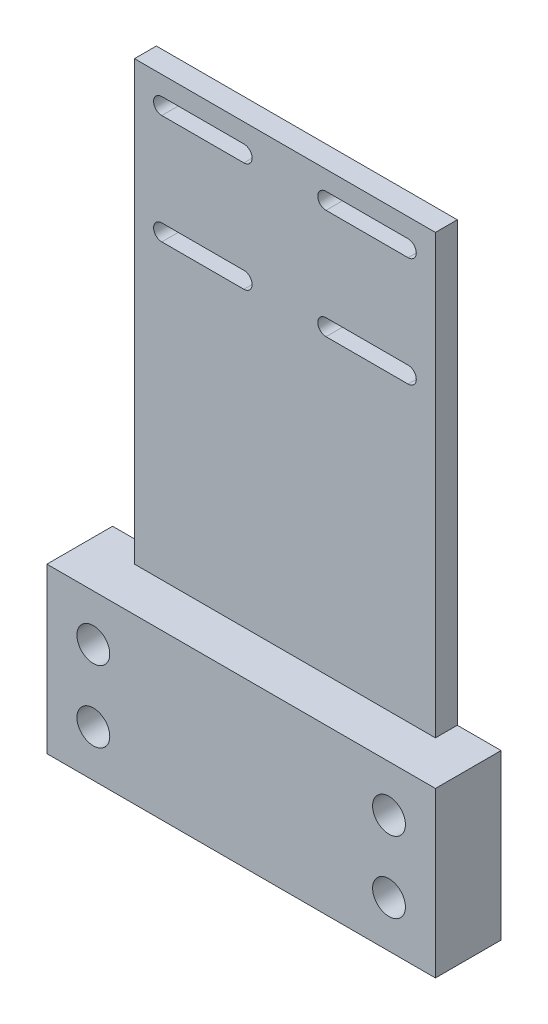
ISO-10303-21;
HEADER;
FILE_DESCRIPTION(('STEP AP214'),'2;1');
FILE_NAME('part.step','',(''),(''),'','','');
FILE_SCHEMA(('AUTOMOTIVE_DESIGN { 1 0 10303 214 1 1 1 1 }'));
ENDSEC;
DATA;
#1=APPLICATION_CONTEXT('core data for automotive mechanical design processes');
#2=APPLICATION_PROTOCOL_DEFINITION('international standard','automotive_design',2000,#1);
#3=PRODUCT_CONTEXT('',#1,'mechanical');
#4=PRODUCT('Part','Part','',(#3));
#5=PRODUCT_RELATED_PRODUCT_CATEGORY('part','',(#4));
#6=PRODUCT_DEFINITION_FORMATION('','',#4);
#7=PRODUCT_DEFINITION_CONTEXT('part definition',#1,'design');
#8=PRODUCT_DEFINITION('design','',#6,#7);
#9=PRODUCT_DEFINITION_SHAPE('','',#8);
#10=(LENGTH_UNIT() NAMED_UNIT(*) SI_UNIT(.MILLI.,.METRE.));
#11=(NAMED_UNIT(*) PLANE_ANGLE_UNIT() SI_UNIT($,.RADIAN.));
#12=(NAMED_UNIT(*) SI_UNIT($,.STERADIAN.) SOLID_ANGLE_UNIT());
#13=UNCERTAINTY_MEASURE_WITH_UNIT(LENGTH_MEASURE(1.E-05),#10,'distance_accuracy_value','');
#14=(GEOMETRIC_REPRESENTATION_CONTEXT(3) GLOBAL_UNCERTAINTY_ASSIGNED_CONTEXT((#13)) GLOBAL_UNIT_ASSIGNED_CONTEXT((#10,
#11,#12)) REPRESENTATION_CONTEXT('',''));
#15=CARTESIAN_POINT('',(0.,0.,0.));
#16=DIRECTION('',(0.,0.,1.));
#17=DIRECTION('',(1.,0.,0.));
#18=AXIS2_PLACEMENT_3D('',#15,#16,#17);
#19=CARTESIAN_POINT('',(27.5,35.,4.));
#20=DIRECTION('',(-1.,0.,0.));
#21=DIRECTION('',(0.,0.,1.));
#22=AXIS2_PLACEMENT_3D('',#19,#20,#21);
#23=PLANE('',#22);
#24=DIRECTION('',(0.,0.,1.));
#25=VECTOR('',#24,1.);
#26=CARTESIAN_POINT('',(27.5,-45.,0.));
#27=LINE('',#26,#25);
#28=CARTESIAN_POINT('',(27.5,-45.,0.));
#29=VERTEX_POINT('',#28);
#30=CARTESIAN_POINT('',(27.5,-45.,4.));
#31=VERTEX_POINT('',#30);
#32=EDGE_CURVE('E65',#29,#31,#27,.T.);
#33=ORIENTED_EDGE('',*,*,#32,.F.);
#34=DIRECTION('',(0.,1.,0.));
#35=VECTOR('',#34,1.);
#36=CARTESIAN_POINT('',(27.5,35.,0.));
#37=LINE('',#36,#35);
#38=CARTESIAN_POINT('',(27.5,35.,0.));
#39=VERTEX_POINT('',#38);
#40=EDGE_CURVE('E453',#29,#39,#37,.T.);
#41=ORIENTED_EDGE('',*,*,#40,.T.);
#42=DIRECTION('',(0.,0.,-1.));
#43=VECTOR('',#42,1.);
#44=CARTESIAN_POINT('',(27.5,35.,4.));
#45=LINE('',#44,#43);
#46=CARTESIAN_POINT('',(27.5,35.,4.));
#47=VERTEX_POINT('',#46);
#48=EDGE_CURVE('E52',#47,#39,#45,.T.);
#49=ORIENTED_EDGE('',*,*,#48,.F.);
#50=DIRECTION('',(0.,1.,0.));
#51=VECTOR('',#50,1.);
#52=CARTESIAN_POINT('',(27.5,35.,4.));
#53=LINE('',#52,#51);
#54=EDGE_CURVE('E454',#31,#47,#53,.T.);
#55=ORIENTED_EDGE('',*,*,#54,.F.);
#56=EDGE_LOOP('',(#33,#41,#49,#55));
#57=FACE_BOUND('',#56,.T.);
#58=ADVANCED_FACE('F49',(#57),#23,.F.);
#59=CARTESIAN_POINT('',(-27.5,35.,4.));
#60=DIRECTION('',(1.,0.,0.));
#61=DIRECTION('',(0.,1.,0.));
#62=AXIS2_PLACEMENT_3D('',#59,#60,#61);
#63=PLANE('',#62);
#64=DIRECTION('',(0.,0.,-1.));
#65=VECTOR('',#64,1.);
#66=CARTESIAN_POINT('',(-27.5,-45.,4.));
#67=LINE('',#66,#65);
#68=CARTESIAN_POINT('',(-27.5,-45.,4.));
#69=VERTEX_POINT('',#68);
#70=CARTESIAN_POINT('',(-27.5,-45.,0.));
#71=VERTEX_POINT('',#70);
#72=EDGE_CURVE('E267',#69,#71,#67,.T.);
#73=ORIENTED_EDGE('',*,*,#72,.F.);
#74=DIRECTION('',(0.,-1.,0.));
#75=VECTOR('',#74,1.);
#76=CARTESIAN_POINT('',(-27.5,35.,4.));
#77=LINE('',#76,#75);
#78=CARTESIAN_POINT('',(-27.5,35.,4.));
#79=VERTEX_POINT('',#78);
#80=EDGE_CURVE('E461',#79,#69,#77,.T.);
#81=ORIENTED_EDGE('',*,*,#80,.F.);
#82=DIRECTION('',(0.,0.,-1.));
#83=VECTOR('',#82,1.);
#84=CARTESIAN_POINT('',(-27.5,35.,4.));
#85=LINE('',#84,#83);
#86=CARTESIAN_POINT('',(-27.5,35.,0.));
#87=VERTEX_POINT('',#86);
#88=EDGE_CURVE('E465',#79,#87,#85,.T.);
#89=ORIENTED_EDGE('',*,*,#88,.T.);
#90=DIRECTION('',(0.,-1.,0.));
#91=VECTOR('',#90,1.);
#92=CARTESIAN_POINT('',(-27.5,35.,0.));
#93=LINE('',#92,#91);
#94=EDGE_CURVE('E458',#87,#71,#93,.T.);
#95=ORIENTED_EDGE('',*,*,#94,.T.);
#96=EDGE_LOOP('',(#73,#81,#89,#95));
#97=FACE_BOUND('',#96,.T.);
#98=ADVANCED_FACE('F494',(#97),#63,.F.);
#99=CARTESIAN_POINT('',(0.,0.,4.));
#100=DIRECTION('',(0.,0.,1.));
#101=DIRECTION('',(1.,0.,0.));
#102=AXIS2_PLACEMENT_3D('',#99,#100,#101);
#103=PLANE('',#102);
#104=DIRECTION('',(-1.,0.,0.));
#105=VECTOR('',#104,1.);
#106=CARTESIAN_POINT('',(-35.5,-45.,4.));
#107=LINE('',#106,#105);
#108=EDGE_CURVE('E11',#31,#69,#107,.T.);
#109=ORIENTED_EDGE('',*,*,#108,.F.);
#110=ORIENTED_EDGE('',*,*,#54,.T.);
#111=DIRECTION('',(-1.,0.,0.));
#112=VECTOR('',#111,1.);
#113=CARTESIAN_POINT('',(-27.5,35.,4.));
#114=LINE('',#113,#112);
#115=EDGE_CURVE('E457',#47,#79,#114,.T.);
#116=ORIENTED_EDGE('',*,*,#115,.T.);
#117=ORIENTED_EDGE('',*,*,#80,.T.);
#118=EDGE_LOOP('',(#109,#110,#116,#117));
#119=FACE_BOUND('',#118,.T.);
#120=DIRECTION('',(1.,0.,0.));
#121=VECTOR('',#120,1.);
#122=CARTESIAN_POINT('',(22.5,28.5,4.));
#123=LINE('',#122,#121);
#124=CARTESIAN_POINT('',(7.50000000000001,28.5,4.));
#125=VERTEX_POINT('',#124);
#126=CARTESIAN_POINT('',(22.5,28.5,4.));
#127=VERTEX_POINT('',#126);
#128=EDGE_CURVE('E414',#125,#127,#123,.T.);
#129=ORIENTED_EDGE('',*,*,#128,.F.);
#130=CARTESIAN_POINT('',(7.50000000000001,30.,4.));
#131=DIRECTION('',(0.,0.,1.));
#132=DIRECTION('',(-1.,0.,0.));
#133=AXIS2_PLACEMENT_3D('',#130,#131,#132);
#134=CIRCLE('',#133,1.5);
#135=CARTESIAN_POINT('',(7.50000000000001,31.5,4.));
#136=VERTEX_POINT('',#135);
#137=EDGE_CURVE('E411',#136,#125,#134,.T.);
#138=ORIENTED_EDGE('',*,*,#137,.F.);
#139=DIRECTION('',(-1.,0.,0.));
#140=VECTOR('',#139,1.);
#141=CARTESIAN_POINT('',(22.4999999999999,31.5,4.));
#142=LINE('',#141,#140);
#143=CARTESIAN_POINT('',(22.4999999999999,31.5,4.));
#144=VERTEX_POINT('',#143);
#145=EDGE_CURVE('E422',#144,#136,#142,.T.);
#146=ORIENTED_EDGE('',*,*,#145,.F.);
#147=CARTESIAN_POINT('',(22.5,30.,4.));
#148=DIRECTION('',(0.,0.,1.));
#149=DIRECTION('',(1.,0.,0.));
#150=AXIS2_PLACEMENT_3D('',#147,#148,#149);
#151=CIRCLE('',#150,1.5);
#152=EDGE_CURVE('E418',#127,#144,#151,.T.);
#153=ORIENTED_EDGE('',*,*,#152,.F.);
#154=EDGE_LOOP('',(#129,#138,#146,#153));
#155=FACE_BOUND('',#154,.T.);
#156=DIRECTION('',(1.,0.,0.));
#157=VECTOR('',#156,1.);
#158=CARTESIAN_POINT('',(22.5,8.5,4.));
#159=LINE('',#158,#157);
#160=CARTESIAN_POINT('',(7.50000000000002,8.5,4.));
#161=VERTEX_POINT('',#160);
#162=CARTESIAN_POINT('',(22.5,8.5,4.));
#163=VERTEX_POINT('',#162);
#164=EDGE_CURVE('E371',#161,#163,#159,.T.);
#165=ORIENTED_EDGE('',*,*,#164,.F.);
#166=CARTESIAN_POINT('',(7.50000000000002,10.,4.));
#167=DIRECTION('',(0.,0.,1.));
#168=DIRECTION('',(-1.,0.,0.));
#169=AXIS2_PLACEMENT_3D('',#166,#167,#168);
#170=CIRCLE('',#169,1.5);
#171=CARTESIAN_POINT('',(7.50000000000002,11.5,4.));
#172=VERTEX_POINT('',#171);
#173=EDGE_CURVE('E368',#172,#161,#170,.T.);
#174=ORIENTED_EDGE('',*,*,#173,.F.);
#175=DIRECTION('',(-1.,0.,0.));
#176=VECTOR('',#175,1.);
#177=CARTESIAN_POINT('',(22.5,11.5,4.));
#178=LINE('',#177,#176);
#179=CARTESIAN_POINT('',(22.5,11.5,4.));
#180=VERTEX_POINT('',#179);
#181=EDGE_CURVE('E379',#180,#172,#178,.T.);
#182=ORIENTED_EDGE('',*,*,#181,.F.);
#183=CARTESIAN_POINT('',(22.5,10.,4.));
#184=DIRECTION('',(0.,0.,1.));
#185=DIRECTION('',(1.,0.,0.));
#186=AXIS2_PLACEMENT_3D('',#183,#184,#185);
#187=CIRCLE('',#186,1.5);
#188=EDGE_CURVE('E375',#163,#180,#187,.T.);
#189=ORIENTED_EDGE('',*,*,#188,.F.);
#190=EDGE_LOOP('',(#165,#174,#182,#189));
#191=FACE_BOUND('',#190,.T.);
#192=DIRECTION('',(-1.,0.,0.));
#193=VECTOR('',#192,1.);
#194=CARTESIAN_POINT('',(-22.5,11.5,4.));
#195=LINE('',#194,#193);
#196=CARTESIAN_POINT('',(-7.5,11.5,4.));
#197=VERTEX_POINT('',#196);
#198=CARTESIAN_POINT('',(-22.5,11.5,4.));
#199=VERTEX_POINT('',#198);
#200=EDGE_CURVE('E328',#197,#199,#195,.T.);
#201=ORIENTED_EDGE('',*,*,#200,.F.);
#202=CARTESIAN_POINT('',(-7.5,10.,4.));
#203=DIRECTION('',(0.,0.,1.));
#204=DIRECTION('',(1.,0.,0.));
#205=AXIS2_PLACEMENT_3D('',#202,#203,#204);
#206=CIRCLE('',#205,1.5);
#207=CARTESIAN_POINT('',(-7.5,8.5,4.));
#208=VERTEX_POINT('',#207);
#209=EDGE_CURVE('E325',#208,#197,#206,.T.);
#210=ORIENTED_EDGE('',*,*,#209,.F.);
#211=DIRECTION('',(1.,0.,0.));
#212=VECTOR('',#211,1.);
#213=CARTESIAN_POINT('',(-22.5,8.5,4.));
#214=LINE('',#213,#212);
#215=CARTESIAN_POINT('',(-22.5,8.5,4.));
#216=VERTEX_POINT('',#215);
#217=EDGE_CURVE('E336',#216,#208,#214,.T.);
#218=ORIENTED_EDGE('',*,*,#217,.F.);
#219=CARTESIAN_POINT('',(-22.5,10.,4.));
#220=DIRECTION('',(0.,0.,1.));
#221=DIRECTION('',(-1.,0.,0.));
#222=AXIS2_PLACEMENT_3D('',#219,#220,#221);
#223=CIRCLE('',#222,1.5);
#224=EDGE_CURVE('E332',#199,#216,#223,.T.);
#225=ORIENTED_EDGE('',*,*,#224,.F.);
#226=EDGE_LOOP('',(#201,#210,#218,#225));
#227=FACE_BOUND('',#226,.T.);
#228=DIRECTION('',(1.,0.,0.));
#229=VECTOR('',#228,1.);
#230=CARTESIAN_POINT('',(-7.5,28.5,4.));
#231=LINE('',#230,#229);
#232=CARTESIAN_POINT('',(-22.5,28.5,4.));
#233=VERTEX_POINT('',#232);
#234=CARTESIAN_POINT('',(-7.5,28.5,4.));
#235=VERTEX_POINT('',#234);
#236=EDGE_CURVE('E285',#233,#235,#231,.T.);
#237=ORIENTED_EDGE('',*,*,#236,.F.);
#238=CARTESIAN_POINT('',(-22.5,30.,4.));
#239=DIRECTION('',(0.,0.,1.));
#240=DIRECTION('',(-1.,0.,0.));
#241=AXIS2_PLACEMENT_3D('',#238,#239,#240);
#242=CIRCLE('',#241,1.5);
#243=CARTESIAN_POINT('',(-22.5,31.5,4.));
#244=VERTEX_POINT('',#243);
#245=EDGE_CURVE('E282',#244,#233,#242,.T.);
#246=ORIENTED_EDGE('',*,*,#245,.F.);
#247=DIRECTION('',(-1.,0.,0.));
#248=VECTOR('',#247,1.);
#249=CARTESIAN_POINT('',(-7.5,31.5,4.));
#250=LINE('',#249,#248);
#251=CARTESIAN_POINT('',(-7.5,31.5,4.));
#252=VERTEX_POINT('',#251);
#253=EDGE_CURVE('E293',#252,#244,#250,.T.);
#254=ORIENTED_EDGE('',*,*,#253,.F.);
#255=CARTESIAN_POINT('',(-7.5,30.,4.));
#256=DIRECTION('',(0.,0.,1.));
#257=DIRECTION('',(1.,0.,0.));
#258=AXIS2_PLACEMENT_3D('',#255,#256,#257);
#259=CIRCLE('',#258,1.5);
#260=EDGE_CURVE('E289',#235,#252,#259,.T.);
#261=ORIENTED_EDGE('',*,*,#260,.F.);
#262=EDGE_LOOP('',(#237,#246,#254,#261));
#263=FACE_BOUND('',#262,.T.);
#264=ADVANCED_FACE('F514',(#119,#155,#191,#227,#263),#103,.T.);
#265=CARTESIAN_POINT('',(0.,0.,0.));
#266=DIRECTION('',(0.,0.,1.));
#267=DIRECTION('',(1.,0.,0.));
#268=AXIS2_PLACEMENT_3D('',#265,#266,#267);
#269=PLANE('',#268);
#270=CARTESIAN_POINT('',(-27.0147186257616,-53.4852813742384,0.));
#271=DIRECTION('',(0.,0.,-1.));
#272=DIRECTION('',(-1.,0.,0.));
#273=AXIS2_PLACEMENT_3D('',#270,#271,#272);
#274=CIRCLE('',#273,5.);
#275=CARTESIAN_POINT('',(-32.0147186257616,-53.4852813742384,0.));
#276=VERTEX_POINT('',#275);
#277=EDGE_CURVE('E539',#276,#276,#274,.T.);
#278=ORIENTED_EDGE('',*,*,#277,.F.);
#279=EDGE_LOOP('',(#278));
#280=FACE_BOUND('',#279,.T.);
#281=CARTESIAN_POINT('',(27.0147186257614,-53.4852813742384,0.));
#282=DIRECTION('',(0.,0.,-1.));
#283=DIRECTION('',(-1.,0.,0.));
#284=AXIS2_PLACEMENT_3D('',#281,#282,#283);
#285=CIRCLE('',#284,5.);
#286=CARTESIAN_POINT('',(22.0147186257614,-53.4852813742384,0.));
#287=VERTEX_POINT('',#286);
#288=EDGE_CURVE('E543',#287,#287,#285,.T.);
#289=ORIENTED_EDGE('',*,*,#288,.F.);
#290=EDGE_LOOP('',(#289));
#291=FACE_BOUND('',#290,.T.);
#292=CARTESIAN_POINT('',(27.0147186257614,-66.5147186257614,0.));
#293=DIRECTION('',(0.,0.,-1.));
#294=DIRECTION('',(-1.,0.,0.));
#295=AXIS2_PLACEMENT_3D('',#292,#293,#294);
#296=CIRCLE('',#295,5.);
#297=CARTESIAN_POINT('',(22.0147186257614,-66.5147186257614,0.));
#298=VERTEX_POINT('',#297);
#299=EDGE_CURVE('E547',#298,#298,#296,.T.);
#300=ORIENTED_EDGE('',*,*,#299,.F.);
#301=EDGE_LOOP('',(#300));
#302=FACE_BOUND('',#301,.T.);
#303=CARTESIAN_POINT('',(-27.0147186257616,-66.5147186257614,0.));
#304=DIRECTION('',(0.,0.,-1.));
#305=DIRECTION('',(-1.,0.,0.));
#306=AXIS2_PLACEMENT_3D('',#303,#304,#305);
#307=CIRCLE('',#306,5.);
#308=CARTESIAN_POINT('',(-32.0147186257616,-66.5147186257614,0.));
#309=VERTEX_POINT('',#308);
#310=EDGE_CURVE('E551',#309,#309,#307,.T.);
#311=ORIENTED_EDGE('',*,*,#310,.F.);
#312=EDGE_LOOP('',(#311));
#313=FACE_BOUND('',#312,.T.);
#314=CARTESIAN_POINT('',(-7.5,10.,0.));
#315=DIRECTION('',(0.,0.,1.));
#316=DIRECTION('',(1.,0.,0.));
#317=AXIS2_PLACEMENT_3D('',#314,#315,#316);
#318=CIRCLE('',#317,1.5);
#319=CARTESIAN_POINT('',(-7.5,8.5,0.));
#320=VERTEX_POINT('',#319);
#321=CARTESIAN_POINT('',(-7.5,11.5,0.));
#322=VERTEX_POINT('',#321);
#323=EDGE_CURVE('E324',#320,#322,#318,.T.);
#324=ORIENTED_EDGE('',*,*,#323,.T.);
#325=DIRECTION('',(-1.,0.,0.));
#326=VECTOR('',#325,1.);
#327=CARTESIAN_POINT('',(-22.5,11.5,0.));
#328=LINE('',#327,#326);
#329=CARTESIAN_POINT('',(-22.5,11.5,0.));
#330=VERTEX_POINT('',#329);
#331=EDGE_CURVE('E343',#322,#330,#328,.T.);
#332=ORIENTED_EDGE('',*,*,#331,.T.);
#333=CARTESIAN_POINT('',(-22.5,10.,0.));
#334=DIRECTION('',(0.,0.,1.));
#335=DIRECTION('',(-1.,0.,0.));
#336=AXIS2_PLACEMENT_3D('',#333,#334,#335);
#337=CIRCLE('',#336,1.5);
#338=CARTESIAN_POINT('',(-22.5,8.5,0.));
#339=VERTEX_POINT('',#338);
#340=EDGE_CURVE('E347',#330,#339,#337,.T.);
#341=ORIENTED_EDGE('',*,*,#340,.T.);
#342=DIRECTION('',(1.,0.,0.));
#343=VECTOR('',#342,1.);
#344=CARTESIAN_POINT('',(-22.5,8.5,0.));
#345=LINE('',#344,#343);
#346=EDGE_CURVE('E329',#339,#320,#345,.T.);
#347=ORIENTED_EDGE('',*,*,#346,.T.);
#348=EDGE_LOOP('',(#324,#332,#341,#347));
#349=FACE_BOUND('',#348,.T.);
#350=CARTESIAN_POINT('',(7.50000000000001,30.,0.));
#351=DIRECTION('',(0.,0.,1.));
#352=DIRECTION('',(-1.,0.,0.));
#353=AXIS2_PLACEMENT_3D('',#350,#351,#352);
#354=CIRCLE('',#353,1.5);
#355=CARTESIAN_POINT('',(7.50000000000001,31.5,0.));
#356=VERTEX_POINT('',#355);
#357=CARTESIAN_POINT('',(7.50000000000001,28.5,0.));
#358=VERTEX_POINT('',#357);
#359=EDGE_CURVE('E410',#356,#358,#354,.T.);
#360=ORIENTED_EDGE('',*,*,#359,.T.);
#361=DIRECTION('',(1.,0.,0.));
#362=VECTOR('',#361,1.);
#363=CARTESIAN_POINT('',(22.5,28.5,0.));
#364=LINE('',#363,#362);
#365=CARTESIAN_POINT('',(22.5,28.5,0.));
#366=VERTEX_POINT('',#365);
#367=EDGE_CURVE('E429',#358,#366,#364,.T.);
#368=ORIENTED_EDGE('',*,*,#367,.T.);
#369=CARTESIAN_POINT('',(22.5,30.,0.));
#370=DIRECTION('',(0.,0.,1.));
#371=DIRECTION('',(1.,0.,0.));
#372=AXIS2_PLACEMENT_3D('',#369,#370,#371);
#373=CIRCLE('',#372,1.5);
#374=CARTESIAN_POINT('',(22.4999999999999,31.5,0.));
#375=VERTEX_POINT('',#374);
#376=EDGE_CURVE('E433',#366,#375,#373,.T.);
#377=ORIENTED_EDGE('',*,*,#376,.T.);
#378=DIRECTION('',(-1.,0.,0.));
#379=VECTOR('',#378,1.);
#380=CARTESIAN_POINT('',(22.4999999999999,31.5,0.));
#381=LINE('',#380,#379);
#382=EDGE_CURVE('E415',#375,#356,#381,.T.);
#383=ORIENTED_EDGE('',*,*,#382,.T.);
#384=EDGE_LOOP('',(#360,#368,#377,#383));
#385=FACE_BOUND('',#384,.T.);
#386=ORIENTED_EDGE('',*,*,#40,.F.);
#387=DIRECTION('',(-1.,0.,0.));
#388=VECTOR('',#387,1.);
#389=CARTESIAN_POINT('',(35.5,-45.,0.));
#390=LINE('',#389,#388);
#391=CARTESIAN_POINT('',(35.5,-45.,0.));
#392=VERTEX_POINT('',#391);
#393=EDGE_CURVE('E261',#392,#29,#390,.T.);
#394=ORIENTED_EDGE('',*,*,#393,.F.);
#395=DIRECTION('',(0.,1.,0.));
#396=VECTOR('',#395,1.);
#397=CARTESIAN_POINT('',(35.5,-75.,0.));
#398=LINE('',#397,#396);
#399=CARTESIAN_POINT('',(35.5,-75.,0.));
#400=VERTEX_POINT('',#399);
#401=EDGE_CURVE('E252',#400,#392,#398,.T.);
#402=ORIENTED_EDGE('',*,*,#401,.F.);
#403=DIRECTION('',(1.,0.,0.));
#404=VECTOR('',#403,1.);
#405=CARTESIAN_POINT('',(27.5,-75.,0.));
#406=LINE('',#405,#404);
#407=CARTESIAN_POINT('',(-35.5,-75.,0.));
#408=VERTEX_POINT('',#407);
#409=EDGE_CURVE('E278',#408,#400,#406,.T.);
#410=ORIENTED_EDGE('',*,*,#409,.F.);
#411=DIRECTION('',(0.,-1.,0.));
#412=VECTOR('',#411,1.);
#413=CARTESIAN_POINT('',(-35.5,-75.,0.));
#414=LINE('',#413,#412);
#415=CARTESIAN_POINT('',(-35.5,-45.,0.));
#416=VERTEX_POINT('',#415);
#417=EDGE_CURVE('E217',#416,#408,#414,.T.);
#418=ORIENTED_EDGE('',*,*,#417,.F.);
#419=DIRECTION('',(1.,0.,0.));
#420=VECTOR('',#419,1.);
#421=CARTESIAN_POINT('',(-35.5,-45.,0.));
#422=LINE('',#421,#420);
#423=EDGE_CURVE('E220',#416,#71,#422,.T.);
#424=ORIENTED_EDGE('',*,*,#423,.T.);
#425=ORIENTED_EDGE('',*,*,#94,.F.);
#426=DIRECTION('',(-1.,0.,0.));
#427=VECTOR('',#426,1.);
#428=CARTESIAN_POINT('',(-27.5,35.,0.));
#429=LINE('',#428,#427);
#430=EDGE_CURVE('E468',#39,#87,#429,.T.);
#431=ORIENTED_EDGE('',*,*,#430,.F.);
#432=EDGE_LOOP('',(#386,#394,#402,#410,#418,#424,#425,#431));
#433=FACE_BOUND('',#432,.T.);
#434=CARTESIAN_POINT('',(7.50000000000002,10.,0.));
#435=DIRECTION('',(0.,0.,1.));
#436=DIRECTION('',(-1.,0.,0.));
#437=AXIS2_PLACEMENT_3D('',#434,#435,#436);
#438=CIRCLE('',#437,1.5);
#439=CARTESIAN_POINT('',(7.50000000000002,11.5,0.));
#440=VERTEX_POINT('',#439);
#441=CARTESIAN_POINT('',(7.50000000000002,8.5,0.));
#442=VERTEX_POINT('',#441);
#443=EDGE_CURVE('E367',#440,#442,#438,.T.);
#444=ORIENTED_EDGE('',*,*,#443,.T.);
#445=DIRECTION('',(1.,0.,0.));
#446=VECTOR('',#445,1.);
#447=CARTESIAN_POINT('',(22.5,8.5,0.));
#448=LINE('',#447,#446);
#449=CARTESIAN_POINT('',(22.5,8.5,0.));
#450=VERTEX_POINT('',#449);
#451=EDGE_CURVE('E386',#442,#450,#448,.T.);
#452=ORIENTED_EDGE('',*,*,#451,.T.);
#453=CARTESIAN_POINT('',(22.5,10.,0.));
#454=DIRECTION('',(0.,0.,1.));
#455=DIRECTION('',(1.,0.,0.));
#456=AXIS2_PLACEMENT_3D('',#453,#454,#455);
#457=CIRCLE('',#456,1.5);
#458=CARTESIAN_POINT('',(22.5,11.5,0.));
#459=VERTEX_POINT('',#458);
#460=EDGE_CURVE('E390',#450,#459,#457,.T.);
#461=ORIENTED_EDGE('',*,*,#460,.T.);
#462=DIRECTION('',(-1.,0.,0.));
#463=VECTOR('',#462,1.);
#464=CARTESIAN_POINT('',(22.5,11.5,0.));
#465=LINE('',#464,#463);
#466=EDGE_CURVE('E372',#459,#440,#465,.T.);
#467=ORIENTED_EDGE('',*,*,#466,.T.);
#468=EDGE_LOOP('',(#444,#452,#461,#467));
#469=FACE_BOUND('',#468,.T.);
#470=CARTESIAN_POINT('',(-22.5,30.,0.));
#471=DIRECTION('',(0.,0.,1.));
#472=DIRECTION('',(-1.,0.,0.));
#473=AXIS2_PLACEMENT_3D('',#470,#471,#472);
#474=CIRCLE('',#473,1.5);
#475=CARTESIAN_POINT('',(-22.5,31.5,0.));
#476=VERTEX_POINT('',#475);
#477=CARTESIAN_POINT('',(-22.5,28.5,0.));
#478=VERTEX_POINT('',#477);
#479=EDGE_CURVE('E281',#476,#478,#474,.T.);
#480=ORIENTED_EDGE('',*,*,#479,.T.);
#481=DIRECTION('',(1.,0.,0.));
#482=VECTOR('',#481,1.);
#483=CARTESIAN_POINT('',(-7.5,28.5,0.));
#484=LINE('',#483,#482);
#485=CARTESIAN_POINT('',(-7.5,28.5,0.));
#486=VERTEX_POINT('',#485);
#487=EDGE_CURVE('E300',#478,#486,#484,.T.);
#488=ORIENTED_EDGE('',*,*,#487,.T.);
#489=CARTESIAN_POINT('',(-7.5,30.,0.));
#490=DIRECTION('',(0.,0.,1.));
#491=DIRECTION('',(1.,0.,0.));
#492=AXIS2_PLACEMENT_3D('',#489,#490,#491);
#493=CIRCLE('',#492,1.5);
#494=CARTESIAN_POINT('',(-7.5,31.5,0.));
#495=VERTEX_POINT('',#494);
#496=EDGE_CURVE('E304',#486,#495,#493,.T.);
#497=ORIENTED_EDGE('',*,*,#496,.T.);
#498=DIRECTION('',(-1.,0.,0.));
#499=VECTOR('',#498,1.);
#500=CARTESIAN_POINT('',(-7.5,31.5,0.));
#501=LINE('',#500,#499);
#502=EDGE_CURVE('E286',#495,#476,#501,.T.);
#503=ORIENTED_EDGE('',*,*,#502,.T.);
#504=EDGE_LOOP('',(#480,#488,#497,#503));
#505=FACE_BOUND('',#504,.T.);
#506=ADVANCED_FACE('F491',(#280,#291,#302,#313,#349,#385,#433,#469,#505),#269,.F.);
#507=CARTESIAN_POINT('',(-27.5,35.,4.));
#508=DIRECTION('',(0.,-1.,0.));
#509=DIRECTION('',(0.,0.,-1.));
#510=AXIS2_PLACEMENT_3D('',#507,#508,#509);
#511=PLANE('',#510);
#512=ORIENTED_EDGE('',*,*,#430,.T.);
#513=ORIENTED_EDGE('',*,*,#88,.F.);
#514=ORIENTED_EDGE('',*,*,#115,.F.);
#515=ORIENTED_EDGE('',*,*,#48,.T.);
#516=EDGE_LOOP('',(#512,#513,#514,#515));
#517=FACE_BOUND('',#516,.T.);
#518=ADVANCED_FACE('F487',(#517),#511,.F.);
#519=CARTESIAN_POINT('',(7.50000000000001,30.,4.));
#520=DIRECTION('',(0.,0.,-1.));
#521=DIRECTION('',(-1.,0.,0.));
#522=AXIS2_PLACEMENT_3D('',#519,#520,#521);
#523=CYLINDRICAL_SURFACE('',#522,1.5);
#524=ORIENTED_EDGE('',*,*,#359,.F.);
#525=DIRECTION('',(0.,0.,-1.));
#526=VECTOR('',#525,1.);
#527=CARTESIAN_POINT('',(7.50000000000001,31.5,4.));
#528=LINE('',#527,#526);
#529=EDGE_CURVE('E425',#136,#356,#528,.T.);
#530=ORIENTED_EDGE('',*,*,#529,.F.);
#531=ORIENTED_EDGE('',*,*,#137,.T.);
#532=DIRECTION('',(0.,0.,-1.));
#533=VECTOR('',#532,1.);
#534=CARTESIAN_POINT('',(7.50000000000001,28.5,4.));
#535=LINE('',#534,#533);
#536=EDGE_CURVE('E449',#125,#358,#535,.T.);
#537=ORIENTED_EDGE('',*,*,#536,.T.);
#538=EDGE_LOOP('',(#524,#530,#531,#537));
#539=FACE_BOUND('',#538,.T.);
#540=ADVANCED_FACE('F523',(#539),#523,.F.);
#541=CARTESIAN_POINT('',(22.5,28.5,4.));
#542=DIRECTION('',(0.,1.,0.));
#543=DIRECTION('',(-1.,0.,0.));
#544=AXIS2_PLACEMENT_3D('',#541,#542,#543);
#545=PLANE('',#544);
#546=ORIENTED_EDGE('',*,*,#367,.F.);
#547=ORIENTED_EDGE('',*,*,#536,.F.);
#548=ORIENTED_EDGE('',*,*,#128,.T.);
#549=DIRECTION('',(0.,0.,-1.));
#550=VECTOR('',#549,1.);
#551=CARTESIAN_POINT('',(22.5,28.5,4.));
#552=LINE('',#551,#550);
#553=EDGE_CURVE('E446',#127,#366,#552,.T.);
#554=ORIENTED_EDGE('',*,*,#553,.T.);
#555=EDGE_LOOP('',(#546,#547,#548,#554));
#556=FACE_BOUND('',#555,.T.);
#557=ADVANCED_FACE('F527',(#556),#545,.T.);
#558=CARTESIAN_POINT('',(22.5,30.,4.));
#559=DIRECTION('',(0.,0.,-1.));
#560=DIRECTION('',(-1.,0.,0.));
#561=AXIS2_PLACEMENT_3D('',#558,#559,#560);
#562=CYLINDRICAL_SURFACE('',#561,1.5);
#563=ORIENTED_EDGE('',*,*,#376,.F.);
#564=ORIENTED_EDGE('',*,*,#553,.F.);
#565=ORIENTED_EDGE('',*,*,#152,.T.);
#566=DIRECTION('',(0.,0.,-1.));
#567=VECTOR('',#566,1.);
#568=CARTESIAN_POINT('',(22.4999999999999,31.5,4.));
#569=LINE('',#568,#567);
#570=EDGE_CURVE('E443',#144,#375,#569,.T.);
#571=ORIENTED_EDGE('',*,*,#570,.T.);
#572=EDGE_LOOP('',(#563,#564,#565,#571));
#573=FACE_BOUND('',#572,.T.);
#574=ADVANCED_FACE('F568',(#573),#562,.F.);
#575=CARTESIAN_POINT('',(22.4999999999999,31.5,4.));
#576=DIRECTION('',(0.,-1.,0.));
#577=DIRECTION('',(1.,0.,0.));
#578=AXIS2_PLACEMENT_3D('',#575,#576,#577);
#579=PLANE('',#578);
#580=ORIENTED_EDGE('',*,*,#382,.F.);
#581=ORIENTED_EDGE('',*,*,#570,.F.);
#582=ORIENTED_EDGE('',*,*,#145,.T.);
#583=ORIENTED_EDGE('',*,*,#529,.T.);
#584=EDGE_LOOP('',(#580,#581,#582,#583));
#585=FACE_BOUND('',#584,.T.);
#586=ADVANCED_FACE('F558',(#585),#579,.T.);
#587=CARTESIAN_POINT('',(7.50000000000002,10.,4.));
#588=DIRECTION('',(0.,0.,-1.));
#589=DIRECTION('',(-1.,0.,0.));
#590=AXIS2_PLACEMENT_3D('',#587,#588,#589);
#591=CYLINDRICAL_SURFACE('',#590,1.5);
#592=ORIENTED_EDGE('',*,*,#443,.F.);
#593=DIRECTION('',(0.,0.,-1.));
#594=VECTOR('',#593,1.);
#595=CARTESIAN_POINT('',(7.50000000000002,11.5,4.));
#596=LINE('',#595,#594);
#597=EDGE_CURVE('E382',#172,#440,#596,.T.);
#598=ORIENTED_EDGE('',*,*,#597,.F.);
#599=ORIENTED_EDGE('',*,*,#173,.T.);
#600=DIRECTION('',(0.,0.,-1.));
#601=VECTOR('',#600,1.);
#602=CARTESIAN_POINT('',(7.50000000000002,8.5,4.));
#603=LINE('',#602,#601);
#604=EDGE_CURVE('E406',#161,#442,#603,.T.);
#605=ORIENTED_EDGE('',*,*,#604,.T.);
#606=EDGE_LOOP('',(#592,#598,#599,#605));
#607=FACE_BOUND('',#606,.T.);
#608=ADVANCED_FACE('F575',(#607),#591,.F.);
#609=CARTESIAN_POINT('',(22.5,8.5,4.));
#610=DIRECTION('',(0.,1.,0.));
#611=DIRECTION('',(-1.,0.,0.));
#612=AXIS2_PLACEMENT_3D('',#609,#610,#611);
#613=PLANE('',#612);
#614=ORIENTED_EDGE('',*,*,#451,.F.);
#615=ORIENTED_EDGE('',*,*,#604,.F.);
#616=ORIENTED_EDGE('',*,*,#164,.T.);
#617=DIRECTION('',(0.,0.,-1.));
#618=VECTOR('',#617,1.);
#619=CARTESIAN_POINT('',(22.5,8.5,4.));
#620=LINE('',#619,#618);
#621=EDGE_CURVE('E403',#163,#450,#620,.T.);
#622=ORIENTED_EDGE('',*,*,#621,.T.);
#623=EDGE_LOOP('',(#614,#615,#616,#622));
#624=FACE_BOUND('',#623,.T.);
#625=ADVANCED_FACE('F581',(#624),#613,.T.);
#626=CARTESIAN_POINT('',(22.5,10.,4.));
#627=DIRECTION('',(0.,0.,-1.));
#628=DIRECTION('',(-1.,0.,0.));
#629=AXIS2_PLACEMENT_3D('',#626,#627,#628);
#630=CYLINDRICAL_SURFACE('',#629,1.5);
#631=ORIENTED_EDGE('',*,*,#460,.F.);
#632=ORIENTED_EDGE('',*,*,#621,.F.);
#633=ORIENTED_EDGE('',*,*,#188,.T.);
#634=DIRECTION('',(0.,0.,-1.));
#635=VECTOR('',#634,1.);
#636=CARTESIAN_POINT('',(22.5,11.5,4.));
#637=LINE('',#636,#635);
#638=EDGE_CURVE('E400',#180,#459,#637,.T.);
#639=ORIENTED_EDGE('',*,*,#638,.T.);
#640=EDGE_LOOP('',(#631,#632,#633,#639));
#641=FACE_BOUND('',#640,.T.);
#642=ADVANCED_FACE('F585',(#641),#630,.F.);
#643=CARTESIAN_POINT('',(22.5,11.5,4.));
#644=DIRECTION('',(0.,-1.,0.));
#645=DIRECTION('',(1.,0.,0.));
#646=AXIS2_PLACEMENT_3D('',#643,#644,#645);
#647=PLANE('',#646);
#648=ORIENTED_EDGE('',*,*,#466,.F.);
#649=ORIENTED_EDGE('',*,*,#638,.F.);
#650=ORIENTED_EDGE('',*,*,#181,.T.);
#651=ORIENTED_EDGE('',*,*,#597,.T.);
#652=EDGE_LOOP('',(#648,#649,#650,#651));
#653=FACE_BOUND('',#652,.T.);
#654=ADVANCED_FACE('F589',(#653),#647,.T.);
#655=CARTESIAN_POINT('',(-7.5,10.,4.));
#656=DIRECTION('',(0.,0.,-1.));
#657=DIRECTION('',(-1.,0.,0.));
#658=AXIS2_PLACEMENT_3D('',#655,#656,#657);
#659=CYLINDRICAL_SURFACE('',#658,1.5);
#660=ORIENTED_EDGE('',*,*,#323,.F.);
#661=DIRECTION('',(0.,0.,-1.));
#662=VECTOR('',#661,1.);
#663=CARTESIAN_POINT('',(-7.5,8.5,4.));
#664=LINE('',#663,#662);
#665=EDGE_CURVE('E339',#208,#320,#664,.T.);
#666=ORIENTED_EDGE('',*,*,#665,.F.);
#667=ORIENTED_EDGE('',*,*,#209,.T.);
#668=DIRECTION('',(0.,0.,-1.));
#669=VECTOR('',#668,1.);
#670=CARTESIAN_POINT('',(-7.5,11.5,4.));
#671=LINE('',#670,#669);
#672=EDGE_CURVE('E363',#197,#322,#671,.T.);
#673=ORIENTED_EDGE('',*,*,#672,.T.);
#674=EDGE_LOOP('',(#660,#666,#667,#673));
#675=FACE_BOUND('',#674,.T.);
#676=ADVANCED_FACE('F593',(#675),#659,.F.);
#677=CARTESIAN_POINT('',(-22.5,11.5,4.));
#678=DIRECTION('',(0.,-1.,0.));
#679=DIRECTION('',(0.,0.,-1.));
#680=AXIS2_PLACEMENT_3D('',#677,#678,#679);
#681=PLANE('',#680);
#682=ORIENTED_EDGE('',*,*,#331,.F.);
#683=ORIENTED_EDGE('',*,*,#672,.F.);
#684=ORIENTED_EDGE('',*,*,#200,.T.);
#685=DIRECTION('',(0.,0.,-1.));
#686=VECTOR('',#685,1.);
#687=CARTESIAN_POINT('',(-22.5,11.5,4.));
#688=LINE('',#687,#686);
#689=EDGE_CURVE('E360',#199,#330,#688,.T.);
#690=ORIENTED_EDGE('',*,*,#689,.T.);
#691=EDGE_LOOP('',(#682,#683,#684,#690));
#692=FACE_BOUND('',#691,.T.);
#693=ADVANCED_FACE('F597',(#692),#681,.T.);
#694=CARTESIAN_POINT('',(-22.5,10.,4.));
#695=DIRECTION('',(0.,0.,-1.));
#696=DIRECTION('',(-1.,0.,0.));
#697=AXIS2_PLACEMENT_3D('',#694,#695,#696);
#698=CYLINDRICAL_SURFACE('',#697,1.5);
#699=ORIENTED_EDGE('',*,*,#340,.F.);
#700=ORIENTED_EDGE('',*,*,#689,.F.);
#701=ORIENTED_EDGE('',*,*,#224,.T.);
#702=DIRECTION('',(0.,0.,-1.));
#703=VECTOR('',#702,1.);
#704=CARTESIAN_POINT('',(-22.5,8.5,4.));
#705=LINE('',#704,#703);
#706=EDGE_CURVE('E357',#216,#339,#705,.T.);
#707=ORIENTED_EDGE('',*,*,#706,.T.);
#708=EDGE_LOOP('',(#699,#700,#701,#707));
#709=FACE_BOUND('',#708,.T.);
#710=ADVANCED_FACE('F601',(#709),#698,.F.);
#711=CARTESIAN_POINT('',(-22.5,8.5,4.));
#712=DIRECTION('',(0.,1.,0.));
#713=DIRECTION('',(0.,0.,1.));
#714=AXIS2_PLACEMENT_3D('',#711,#712,#713);
#715=PLANE('',#714);
#716=ORIENTED_EDGE('',*,*,#346,.F.);
#717=ORIENTED_EDGE('',*,*,#706,.F.);
#718=ORIENTED_EDGE('',*,*,#217,.T.);
#719=ORIENTED_EDGE('',*,*,#665,.T.);
#720=EDGE_LOOP('',(#716,#717,#718,#719));
#721=FACE_BOUND('',#720,.T.);
#722=ADVANCED_FACE('F605',(#721),#715,.T.);
#723=CARTESIAN_POINT('',(-22.5,30.,4.));
#724=DIRECTION('',(0.,0.,-1.));
#725=DIRECTION('',(-1.,0.,0.));
#726=AXIS2_PLACEMENT_3D('',#723,#724,#725);
#727=CYLINDRICAL_SURFACE('',#726,1.5);
#728=ORIENTED_EDGE('',*,*,#479,.F.);
#729=DIRECTION('',(0.,0.,-1.));
#730=VECTOR('',#729,1.);
#731=CARTESIAN_POINT('',(-22.5,31.5,4.));
#732=LINE('',#731,#730);
#733=EDGE_CURVE('E296',#244,#476,#732,.T.);
#734=ORIENTED_EDGE('',*,*,#733,.F.);
#735=ORIENTED_EDGE('',*,*,#245,.T.);
#736=DIRECTION('',(0.,0.,-1.));
#737=VECTOR('',#736,1.);
#738=CARTESIAN_POINT('',(-22.5,28.5,4.));
#739=LINE('',#738,#737);
#740=EDGE_CURVE('E320',#233,#478,#739,.T.);
#741=ORIENTED_EDGE('',*,*,#740,.T.);
#742=EDGE_LOOP('',(#728,#734,#735,#741));
#743=FACE_BOUND('',#742,.T.);
#744=ADVANCED_FACE('F609',(#743),#727,.F.);
#745=CARTESIAN_POINT('',(-7.5,28.5,4.));
#746=DIRECTION('',(0.,1.,0.));
#747=DIRECTION('',(0.,0.,1.));
#748=AXIS2_PLACEMENT_3D('',#745,#746,#747);
#749=PLANE('',#748);
#750=ORIENTED_EDGE('',*,*,#487,.F.);
#751=ORIENTED_EDGE('',*,*,#740,.F.);
#752=ORIENTED_EDGE('',*,*,#236,.T.);
#753=DIRECTION('',(0.,0.,-1.));
#754=VECTOR('',#753,1.);
#755=CARTESIAN_POINT('',(-7.5,28.5,4.));
#756=LINE('',#755,#754);
#757=EDGE_CURVE('E317',#235,#486,#756,.T.);
#758=ORIENTED_EDGE('',*,*,#757,.T.);
#759=EDGE_LOOP('',(#750,#751,#752,#758));
#760=FACE_BOUND('',#759,.T.);
#761=ADVANCED_FACE('F613',(#760),#749,.T.);
#762=CARTESIAN_POINT('',(-7.5,30.,4.));
#763=DIRECTION('',(0.,0.,-1.));
#764=DIRECTION('',(-1.,0.,0.));
#765=AXIS2_PLACEMENT_3D('',#762,#763,#764);
#766=CYLINDRICAL_SURFACE('',#765,1.5);
#767=ORIENTED_EDGE('',*,*,#496,.F.);
#768=ORIENTED_EDGE('',*,*,#757,.F.);
#769=ORIENTED_EDGE('',*,*,#260,.T.);
#770=DIRECTION('',(0.,0.,-1.));
#771=VECTOR('',#770,1.);
#772=CARTESIAN_POINT('',(-7.5,31.5,4.));
#773=LINE('',#772,#771);
#774=EDGE_CURVE('E314',#252,#495,#773,.T.);
#775=ORIENTED_EDGE('',*,*,#774,.T.);
#776=EDGE_LOOP('',(#767,#768,#769,#775));
#777=FACE_BOUND('',#776,.T.);
#778=ADVANCED_FACE('F617',(#777),#766,.F.);
#779=CARTESIAN_POINT('',(-7.5,31.5,4.));
#780=DIRECTION('',(0.,-1.,0.));
#781=DIRECTION('',(0.,0.,-1.));
#782=AXIS2_PLACEMENT_3D('',#779,#780,#781);
#783=PLANE('',#782);
#784=ORIENTED_EDGE('',*,*,#502,.F.);
#785=ORIENTED_EDGE('',*,*,#774,.F.);
#786=ORIENTED_EDGE('',*,*,#253,.T.);
#787=ORIENTED_EDGE('',*,*,#733,.T.);
#788=EDGE_LOOP('',(#784,#785,#786,#787));
#789=FACE_BOUND('',#788,.T.);
#790=ADVANCED_FACE('F621',(#789),#783,.T.);
#791=CARTESIAN_POINT('',(0.,-75.,0.));
#792=DIRECTION('',(0.,1.,0.));
#793=DIRECTION('',(0.,0.,1.));
#794=AXIS2_PLACEMENT_3D('',#791,#792,#793);
#795=PLANE('',#794);
#796=ORIENTED_EDGE('',*,*,#409,.T.);
#797=DIRECTION('',(0.,0.,-1.));
#798=VECTOR('',#797,1.);
#799=CARTESIAN_POINT('',(35.5,-75.,0.));
#800=LINE('',#799,#798);
#801=CARTESIAN_POINT('',(35.5,-75.,12.));
#802=VERTEX_POINT('',#801);
#803=EDGE_CURVE('E226',#802,#400,#800,.T.);
#804=ORIENTED_EDGE('',*,*,#803,.F.);
#805=DIRECTION('',(1.,0.,0.));
#806=VECTOR('',#805,1.);
#807=CARTESIAN_POINT('',(-35.5,-75.,12.));
#808=LINE('',#807,#806);
#809=CARTESIAN_POINT('',(-35.5,-75.,12.));
#810=VERTEX_POINT('',#809);
#811=EDGE_CURVE('E223',#810,#802,#808,.T.);
#812=ORIENTED_EDGE('',*,*,#811,.F.);
#813=DIRECTION('',(0.,0.,1.));
#814=VECTOR('',#813,1.);
#815=CARTESIAN_POINT('',(-35.5,-75.,4.));
#816=LINE('',#815,#814);
#817=EDGE_CURVE('E211',#408,#810,#816,.T.);
#818=ORIENTED_EDGE('',*,*,#817,.F.);
#819=EDGE_LOOP('',(#796,#804,#812,#818));
#820=FACE_BOUND('',#819,.T.);
#821=ADVANCED_FACE('F224',(#820),#795,.F.);
#822=CARTESIAN_POINT('',(-35.5,-45.,4.));
#823=DIRECTION('',(0.,-1.,0.));
#824=DIRECTION('',(1.,0.,0.));
#825=AXIS2_PLACEMENT_3D('',#822,#823,#824);
#826=PLANE('',#825);
#827=ORIENTED_EDGE('',*,*,#72,.T.);
#828=ORIENTED_EDGE('',*,*,#423,.F.);
#829=DIRECTION('',(0.,0.,-1.));
#830=VECTOR('',#829,1.);
#831=CARTESIAN_POINT('',(-35.5,-45.,4.));
#832=LINE('',#831,#830);
#833=CARTESIAN_POINT('',(-35.5,-45.,12.));
#834=VERTEX_POINT('',#833);
#835=EDGE_CURVE('E268',#834,#416,#832,.T.);
#836=ORIENTED_EDGE('',*,*,#835,.F.);
#837=DIRECTION('',(-1.,0.,0.));
#838=VECTOR('',#837,1.);
#839=CARTESIAN_POINT('',(-35.5,-45.,12.));
#840=LINE('',#839,#838);
#841=CARTESIAN_POINT('',(35.5,-45.,12.));
#842=VERTEX_POINT('',#841);
#843=EDGE_CURVE('E236',#842,#834,#840,.T.);
#844=ORIENTED_EDGE('',*,*,#843,.F.);
#845=DIRECTION('',(0.,0.,1.));
#846=VECTOR('',#845,1.);
#847=CARTESIAN_POINT('',(35.5,-45.,0.));
#848=LINE('',#847,#846);
#849=EDGE_CURVE('E256',#392,#842,#848,.T.);
#850=ORIENTED_EDGE('',*,*,#849,.F.);
#851=ORIENTED_EDGE('',*,*,#393,.T.);
#852=ORIENTED_EDGE('',*,*,#32,.T.);
#853=ORIENTED_EDGE('',*,*,#108,.T.);
#854=EDGE_LOOP('',(#827,#828,#836,#844,#850,#851,#852,#853));
#855=FACE_BOUND('',#854,.T.);
#856=ADVANCED_FACE('F495',(#855),#826,.F.);
#857=CARTESIAN_POINT('',(-35.5,0.,0.));
#858=DIRECTION('',(-1.,0.,0.));
#859=DIRECTION('',(0.,0.,1.));
#860=AXIS2_PLACEMENT_3D('',#857,#858,#859);
#861=PLANE('',#860);
#862=ORIENTED_EDGE('',*,*,#817,.T.);
#863=DIRECTION('',(0.,-1.,0.));
#864=VECTOR('',#863,1.);
#865=CARTESIAN_POINT('',(-35.5,-75.,12.));
#866=LINE('',#865,#864);
#867=EDGE_CURVE('E215',#834,#810,#866,.T.);
#868=ORIENTED_EDGE('',*,*,#867,.F.);
#869=ORIENTED_EDGE('',*,*,#835,.T.);
#870=ORIENTED_EDGE('',*,*,#417,.T.);
#871=EDGE_LOOP('',(#862,#868,#869,#870));
#872=FACE_BOUND('',#871,.T.);
#873=ADVANCED_FACE('F213',(#872),#861,.T.);
#874=CARTESIAN_POINT('',(35.5,0.,0.));
#875=DIRECTION('',(1.,0.,0.));
#876=DIRECTION('',(0.,0.,-1.));
#877=AXIS2_PLACEMENT_3D('',#874,#875,#876);
#878=PLANE('',#877);
#879=ORIENTED_EDGE('',*,*,#401,.T.);
#880=ORIENTED_EDGE('',*,*,#849,.T.);
#881=DIRECTION('',(0.,1.,0.));
#882=VECTOR('',#881,1.);
#883=CARTESIAN_POINT('',(35.5,-75.,12.));
#884=LINE('',#883,#882);
#885=EDGE_CURVE('E231',#802,#842,#884,.T.);
#886=ORIENTED_EDGE('',*,*,#885,.F.);
#887=ORIENTED_EDGE('',*,*,#803,.T.);
#888=EDGE_LOOP('',(#879,#880,#886,#887));
#889=FACE_BOUND('',#888,.T.);
#890=ADVANCED_FACE('F498',(#889),#878,.T.);
#891=CARTESIAN_POINT('',(0.,0.,12.));
#892=DIRECTION('',(0.,0.,-1.));
#893=DIRECTION('',(-1.,0.,0.));
#894=AXIS2_PLACEMENT_3D('',#891,#892,#893);
#895=PLANE('',#894);
#896=CARTESIAN_POINT('',(-27.0147186257616,-66.5147186257616,12.));
#897=DIRECTION('',(0.,0.,1.));
#898=DIRECTION('',(1.,0.,0.));
#899=AXIS2_PLACEMENT_3D('',#896,#897,#898);
#900=CIRCLE('',#899,3.);
#901=CARTESIAN_POINT('',(-24.0147186257616,-66.5147186257616,12.));
#902=VERTEX_POINT('',#901);
#903=EDGE_CURVE('E811',#902,#902,#900,.T.);
#904=ORIENTED_EDGE('',*,*,#903,.F.);
#905=EDGE_LOOP('',(#904));
#906=FACE_BOUND('',#905,.T.);
#907=CARTESIAN_POINT('',(-27.0147186257614,-53.4852813742386,12.));
#908=DIRECTION('',(0.,0.,1.));
#909=DIRECTION('',(1.,0.,0.));
#910=AXIS2_PLACEMENT_3D('',#907,#908,#909);
#911=CIRCLE('',#910,3.);
#912=CARTESIAN_POINT('',(-24.0147186257614,-53.4852813742386,12.));
#913=VERTEX_POINT('',#912);
#914=EDGE_CURVE('E801',#913,#913,#911,.T.);
#915=ORIENTED_EDGE('',*,*,#914,.F.);
#916=EDGE_LOOP('',(#915));
#917=FACE_BOUND('',#916,.T.);
#918=CARTESIAN_POINT('',(27.0147186257614,-53.4852813742386,12.));
#919=DIRECTION('',(0.,0.,1.));
#920=DIRECTION('',(1.,0.,0.));
#921=AXIS2_PLACEMENT_3D('',#918,#919,#920);
#922=CIRCLE('',#921,3.);
#923=CARTESIAN_POINT('',(30.0147186257614,-53.4852813742386,12.));
#924=VERTEX_POINT('',#923);
#925=EDGE_CURVE('E244',#924,#924,#922,.T.);
#926=ORIENTED_EDGE('',*,*,#925,.F.);
#927=EDGE_LOOP('',(#926));
#928=FACE_BOUND('',#927,.T.);
#929=CARTESIAN_POINT('',(27.0147186257614,-66.5147186257616,12.));
#930=DIRECTION('',(0.,0.,1.));
#931=DIRECTION('',(1.,0.,0.));
#932=AXIS2_PLACEMENT_3D('',#929,#930,#931);
#933=CIRCLE('',#932,3.);
#934=CARTESIAN_POINT('',(30.0147186257614,-66.5147186257616,12.));
#935=VERTEX_POINT('',#934);
#936=EDGE_CURVE('E238',#935,#935,#933,.T.);
#937=ORIENTED_EDGE('',*,*,#936,.F.);
#938=EDGE_LOOP('',(#937));
#939=FACE_BOUND('',#938,.T.);
#940=ORIENTED_EDGE('',*,*,#867,.T.);
#941=ORIENTED_EDGE('',*,*,#811,.T.);
#942=ORIENTED_EDGE('',*,*,#885,.T.);
#943=ORIENTED_EDGE('',*,*,#843,.T.);
#944=EDGE_LOOP('',(#940,#941,#942,#943));
#945=FACE_BOUND('',#944,.T.);
#946=ADVANCED_FACE('F234',(#906,#917,#928,#939,#945),#895,.F.);
#947=CARTESIAN_POINT('',(27.0147186257614,-66.5147186257616,4.));
#948=DIRECTION('',(0.,0.,1.));
#949=DIRECTION('',(1.,0.,0.));
#950=AXIS2_PLACEMENT_3D('',#947,#948,#949);
#951=CYLINDRICAL_SURFACE('',#950,3.);
#952=CARTESIAN_POINT('',(27.0147186257614,-66.5147186257616,4.));
#953=DIRECTION('',(0.,0.,1.));
#954=DIRECTION('',(1.,0.,0.));
#955=AXIS2_PLACEMENT_3D('',#952,#953,#954);
#956=CIRCLE('',#955,3.);
#957=CARTESIAN_POINT('',(30.0147186257614,-66.5147186257616,4.));
#958=VERTEX_POINT('',#957);
#959=EDGE_CURVE('E806',#958,#958,#956,.T.);
#960=ORIENTED_EDGE('',*,*,#959,.F.);
#961=EDGE_LOOP('',(#960));
#962=FACE_BOUND('',#961,.T.);
#963=ORIENTED_EDGE('',*,*,#936,.T.);
#964=EDGE_LOOP('',(#963));
#965=FACE_BOUND('',#964,.T.);
#966=ADVANCED_FACE('F505',(#962,#965),#951,.F.);
#967=CARTESIAN_POINT('',(27.0147186257614,-53.4852813742386,4.));
#968=DIRECTION('',(0.,0.,1.));
#969=DIRECTION('',(1.,0.,0.));
#970=AXIS2_PLACEMENT_3D('',#967,#968,#969);
#971=CYLINDRICAL_SURFACE('',#970,3.);
#972=CARTESIAN_POINT('',(27.0147186257614,-53.4852813742386,4.));
#973=DIRECTION('',(0.,0.,1.));
#974=DIRECTION('',(1.,0.,0.));
#975=AXIS2_PLACEMENT_3D('',#972,#973,#974);
#976=CIRCLE('',#975,3.);
#977=CARTESIAN_POINT('',(30.0147186257614,-53.4852813742386,4.));
#978=VERTEX_POINT('',#977);
#979=EDGE_CURVE('E802',#978,#978,#976,.T.);
#980=ORIENTED_EDGE('',*,*,#979,.F.);
#981=EDGE_LOOP('',(#980));
#982=FACE_BOUND('',#981,.T.);
#983=ORIENTED_EDGE('',*,*,#925,.T.);
#984=EDGE_LOOP('',(#983));
#985=FACE_BOUND('',#984,.T.);
#986=ADVANCED_FACE('F664',(#982,#985),#971,.F.);
#987=CARTESIAN_POINT('',(-27.0147186257614,-53.4852813742386,4.));
#988=DIRECTION('',(0.,0.,1.));
#989=DIRECTION('',(1.,0.,0.));
#990=AXIS2_PLACEMENT_3D('',#987,#988,#989);
#991=CYLINDRICAL_SURFACE('',#990,3.);
#992=CARTESIAN_POINT('',(-27.0147186257614,-53.4852813742386,4.));
#993=DIRECTION('',(0.,0.,1.));
#994=DIRECTION('',(1.,0.,0.));
#995=AXIS2_PLACEMENT_3D('',#992,#993,#994);
#996=CIRCLE('',#995,3.);
#997=CARTESIAN_POINT('',(-24.0147186257614,-53.4852813742386,4.));
#998=VERTEX_POINT('',#997);
#999=EDGE_CURVE('E807',#998,#998,#996,.T.);
#1000=ORIENTED_EDGE('',*,*,#999,.F.);
#1001=EDGE_LOOP('',(#1000));
#1002=FACE_BOUND('',#1001,.T.);
#1003=ORIENTED_EDGE('',*,*,#914,.T.);
#1004=EDGE_LOOP('',(#1003));
#1005=FACE_BOUND('',#1004,.T.);
#1006=ADVANCED_FACE('F674',(#1002,#1005),#991,.F.);
#1007=CARTESIAN_POINT('',(-27.0147186257616,-66.5147186257616,4.));
#1008=DIRECTION('',(0.,0.,1.));
#1009=DIRECTION('',(1.,0.,0.));
#1010=AXIS2_PLACEMENT_3D('',#1007,#1008,#1009);
#1011=CYLINDRICAL_SURFACE('',#1010,3.);
#1012=CARTESIAN_POINT('',(-27.0147186257616,-66.5147186257616,4.));
#1013=DIRECTION('',(0.,0.,1.));
#1014=DIRECTION('',(1.,0.,0.));
#1015=AXIS2_PLACEMENT_3D('',#1012,#1013,#1014);
#1016=CIRCLE('',#1015,3.);
#1017=CARTESIAN_POINT('',(-24.0147186257616,-66.5147186257616,4.));
#1018=VERTEX_POINT('',#1017);
#1019=EDGE_CURVE('E795',#1018,#1018,#1016,.T.);
#1020=ORIENTED_EDGE('',*,*,#1019,.F.);
#1021=EDGE_LOOP('',(#1020));
#1022=FACE_BOUND('',#1021,.T.);
#1023=ORIENTED_EDGE('',*,*,#903,.T.);
#1024=EDGE_LOOP('',(#1023));
#1025=FACE_BOUND('',#1024,.T.);
#1026=ADVANCED_FACE('F684',(#1022,#1025),#1011,.F.);
#1027=CARTESIAN_POINT('',(0.,0.,3.99999999999999));
#1028=DIRECTION('',(0.,0.,-1.));
#1029=DIRECTION('',(-1.,0.,0.));
#1030=AXIS2_PLACEMENT_3D('',#1027,#1028,#1029);
#1031=PLANE('',#1030);
#1032=CARTESIAN_POINT('',(-27.0147186257616,-66.5147186257614,3.99999999999999));
#1033=DIRECTION('',(0.,0.,-1.));
#1034=DIRECTION('',(-1.,0.,0.));
#1035=AXIS2_PLACEMENT_3D('',#1032,#1033,#1034);
#1036=CIRCLE('',#1035,5.);
#1037=CARTESIAN_POINT('',(-32.0147186257616,-66.5147186257614,3.99999999999999));
#1038=VERTEX_POINT('',#1037);
#1039=EDGE_CURVE('E791',#1038,#1038,#1036,.T.);
#1040=ORIENTED_EDGE('',*,*,#1039,.T.);
#1041=EDGE_LOOP('',(#1040));
#1042=FACE_BOUND('',#1041,.T.);
#1043=ORIENTED_EDGE('',*,*,#1019,.T.);
#1044=EDGE_LOOP('',(#1043));
#1045=FACE_BOUND('',#1044,.T.);
#1046=ADVANCED_FACE('F693',(#1042,#1045),#1031,.T.);
#1047=CARTESIAN_POINT('',(-27.0147186257616,-66.5147186257614,3.99999999999999));
#1048=DIRECTION('',(0.,0.,-1.));
#1049=DIRECTION('',(-1.,0.,0.));
#1050=AXIS2_PLACEMENT_3D('',#1047,#1048,#1049);
#1051=CYLINDRICAL_SURFACE('',#1050,5.);
#1052=ORIENTED_EDGE('',*,*,#1039,.F.);
#1053=EDGE_LOOP('',(#1052));
#1054=FACE_BOUND('',#1053,.T.);
#1055=ORIENTED_EDGE('',*,*,#310,.T.);
#1056=EDGE_LOOP('',(#1055));
#1057=FACE_BOUND('',#1056,.T.);
#1058=ADVANCED_FACE('F702',(#1054,#1057),#1051,.F.);
#1059=CARTESIAN_POINT('',(27.0147186257614,-66.5147186257614,3.99999999999999));
#1060=DIRECTION('',(0.,0.,-1.));
#1061=DIRECTION('',(-1.,0.,0.));
#1062=AXIS2_PLACEMENT_3D('',#1059,#1060,#1061);
#1063=PLANE('',#1062);
#1064=CARTESIAN_POINT('',(27.0147186257614,-66.5147186257614,3.99999999999999));
#1065=DIRECTION('',(0.,0.,-1.));
#1066=DIRECTION('',(-1.,0.,0.));
#1067=AXIS2_PLACEMENT_3D('',#1064,#1065,#1066);
#1068=CIRCLE('',#1067,5.);
#1069=CARTESIAN_POINT('',(22.0147186257614,-66.5147186257614,3.99999999999999));
#1070=VERTEX_POINT('',#1069);
#1071=EDGE_CURVE('E845',#1070,#1070,#1068,.T.);
#1072=ORIENTED_EDGE('',*,*,#1071,.T.);
#1073=EDGE_LOOP('',(#1072));
#1074=FACE_BOUND('',#1073,.T.);
#1075=ORIENTED_EDGE('',*,*,#959,.T.);
#1076=EDGE_LOOP('',(#1075));
#1077=FACE_BOUND('',#1076,.T.);
#1078=ADVANCED_FACE('F712',(#1074,#1077),#1063,.T.);
#1079=CARTESIAN_POINT('',(27.0147186257614,-66.5147186257614,3.99999999999999));
#1080=DIRECTION('',(0.,0.,-1.));
#1081=DIRECTION('',(-1.,0.,0.));
#1082=AXIS2_PLACEMENT_3D('',#1079,#1080,#1081);
#1083=CYLINDRICAL_SURFACE('',#1082,5.);
#1084=ORIENTED_EDGE('',*,*,#1071,.F.);
#1085=EDGE_LOOP('',(#1084));
#1086=FACE_BOUND('',#1085,.T.);
#1087=ORIENTED_EDGE('',*,*,#299,.T.);
#1088=EDGE_LOOP('',(#1087));
#1089=FACE_BOUND('',#1088,.T.);
#1090=ADVANCED_FACE('F722',(#1086,#1089),#1083,.F.);
#1091=CARTESIAN_POINT('',(27.0147186257614,-53.4852813742384,3.99999999999999));
#1092=DIRECTION('',(0.,0.,-1.));
#1093=DIRECTION('',(-1.,0.,0.));
#1094=AXIS2_PLACEMENT_3D('',#1091,#1092,#1093);
#1095=PLANE('',#1094);
#1096=CARTESIAN_POINT('',(27.0147186257614,-53.4852813742384,3.99999999999999));
#1097=DIRECTION('',(0.,0.,-1.));
#1098=DIRECTION('',(-1.,0.,0.));
#1099=AXIS2_PLACEMENT_3D('',#1096,#1097,#1098);
#1100=CIRCLE('',#1099,5.);
#1101=CARTESIAN_POINT('',(22.0147186257614,-53.4852813742384,3.99999999999999));
#1102=VERTEX_POINT('',#1101);
#1103=EDGE_CURVE('E780',#1102,#1102,#1100,.T.);
#1104=ORIENTED_EDGE('',*,*,#1103,.T.);
#1105=EDGE_LOOP('',(#1104));
#1106=FACE_BOUND('',#1105,.T.);
#1107=ORIENTED_EDGE('',*,*,#979,.T.);
#1108=EDGE_LOOP('',(#1107));
#1109=FACE_BOUND('',#1108,.T.);
#1110=ADVANCED_FACE('F732',(#1106,#1109),#1095,.T.);
#1111=CARTESIAN_POINT('',(27.0147186257614,-53.4852813742384,3.99999999999999));
#1112=DIRECTION('',(0.,0.,-1.));
#1113=DIRECTION('',(-1.,0.,0.));
#1114=AXIS2_PLACEMENT_3D('',#1111,#1112,#1113);
#1115=CYLINDRICAL_SURFACE('',#1114,5.);
#1116=ORIENTED_EDGE('',*,*,#1103,.F.);
#1117=EDGE_LOOP('',(#1116));
#1118=FACE_BOUND('',#1117,.T.);
#1119=ORIENTED_EDGE('',*,*,#288,.T.);
#1120=EDGE_LOOP('',(#1119));
#1121=FACE_BOUND('',#1120,.T.);
#1122=ADVANCED_FACE('F742',(#1118,#1121),#1115,.F.);
#1123=CARTESIAN_POINT('',(-27.0147186257616,-53.4852813742384,3.99999999999999));
#1124=DIRECTION('',(0.,0.,-1.));
#1125=DIRECTION('',(-1.,0.,0.));
#1126=AXIS2_PLACEMENT_3D('',#1123,#1124,#1125);
#1127=PLANE('',#1126);
#1128=CARTESIAN_POINT('',(-27.0147186257616,-53.4852813742384,3.99999999999999));
#1129=DIRECTION('',(0.,0.,-1.));
#1130=DIRECTION('',(-1.,0.,0.));
#1131=AXIS2_PLACEMENT_3D('',#1128,#1129,#1130);
#1132=CIRCLE('',#1131,5.);
#1133=CARTESIAN_POINT('',(-32.0147186257616,-53.4852813742384,3.99999999999999));
#1134=VERTEX_POINT('',#1133);
#1135=EDGE_CURVE('E778',#1134,#1134,#1132,.T.);
#1136=ORIENTED_EDGE('',*,*,#1135,.T.);
#1137=EDGE_LOOP('',(#1136));
#1138=FACE_BOUND('',#1137,.T.);
#1139=ORIENTED_EDGE('',*,*,#999,.T.);
#1140=EDGE_LOOP('',(#1139));
#1141=FACE_BOUND('',#1140,.T.);
#1142=ADVANCED_FACE('F752',(#1138,#1141),#1127,.T.);
#1143=CARTESIAN_POINT('',(-27.0147186257616,-53.4852813742384,3.99999999999999));
#1144=DIRECTION('',(0.,0.,-1.));
#1145=DIRECTION('',(-1.,0.,0.));
#1146=AXIS2_PLACEMENT_3D('',#1143,#1144,#1145);
#1147=CYLINDRICAL_SURFACE('',#1146,5.);
#1148=ORIENTED_EDGE('',*,*,#1135,.F.);
#1149=EDGE_LOOP('',(#1148));
#1150=FACE_BOUND('',#1149,.T.);
#1151=ORIENTED_EDGE('',*,*,#277,.T.);
#1152=EDGE_LOOP('',(#1151));
#1153=FACE_BOUND('',#1152,.T.);
#1154=ADVANCED_FACE('F762',(#1150,#1153),#1147,.F.);
#1155=CLOSED_SHELL('',(#58,#98,#264,#506,#518,#540,#557,#574,#586,#608,#625,#642,#654,#676,#693,
#710,#722,#744,#761,#778,#790,#821,#856,#873,#890,#946,#966,#986,#1006,#1026,#1046,#1058,#1078,
#1090,#1110,#1122,#1142,#1154));
#1156=MANIFOLD_SOLID_BREP('B2',#1155);
#1157=ADVANCED_BREP_SHAPE_REPRESENTATION('',(#18,#1156),#14);
#1158=SHAPE_DEFINITION_REPRESENTATION(#9,#1157);
ENDSEC;
END-ISO-10303-21;
